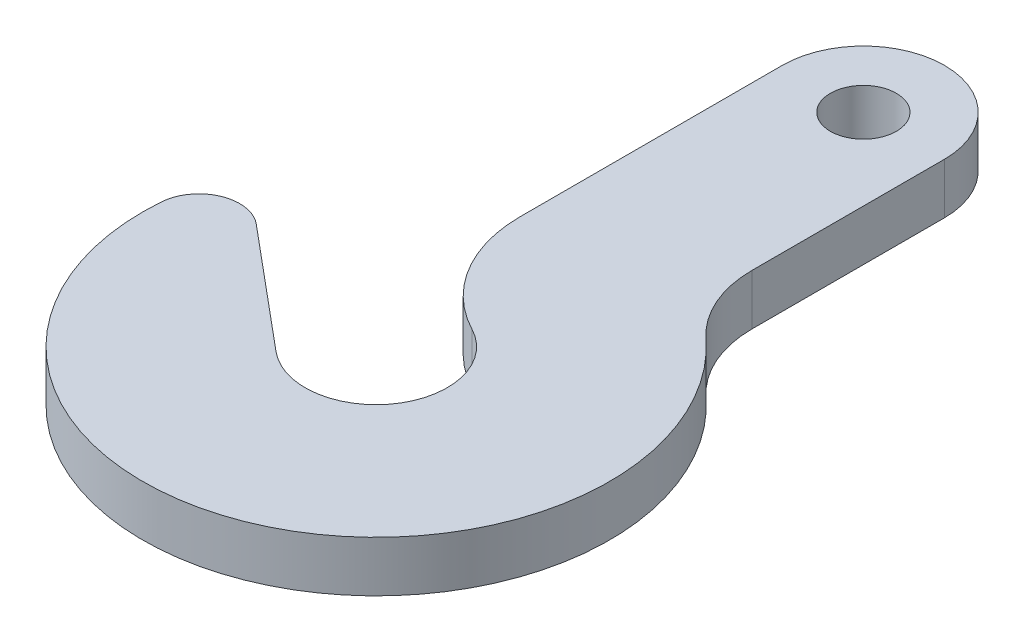
ISO-10303-21;
HEADER;
FILE_DESCRIPTION(('STEP AP214'),'2;1');
FILE_NAME('part.step','',(''),(''),'','','');
FILE_SCHEMA(('AUTOMOTIVE_DESIGN { 1 0 10303 214 1 1 1 1 }'));
ENDSEC;
DATA;
#1=APPLICATION_CONTEXT('core data for automotive mechanical design processes');
#2=APPLICATION_PROTOCOL_DEFINITION('international standard','automotive_design',2000,#1);
#3=PRODUCT_CONTEXT('',#1,'mechanical');
#4=PRODUCT('Part','Part','',(#3));
#5=PRODUCT_RELATED_PRODUCT_CATEGORY('part','',(#4));
#6=PRODUCT_DEFINITION_FORMATION('','',#4);
#7=PRODUCT_DEFINITION_CONTEXT('part definition',#1,'design');
#8=PRODUCT_DEFINITION('design','',#6,#7);
#9=PRODUCT_DEFINITION_SHAPE('','',#8);
#10=(LENGTH_UNIT() NAMED_UNIT(*) SI_UNIT(.MILLI.,.METRE.));
#11=(NAMED_UNIT(*) PLANE_ANGLE_UNIT() SI_UNIT($,.RADIAN.));
#12=(NAMED_UNIT(*) SI_UNIT($,.STERADIAN.) SOLID_ANGLE_UNIT());
#13=UNCERTAINTY_MEASURE_WITH_UNIT(LENGTH_MEASURE(1.E-05),#10,'distance_accuracy_value','');
#14=(GEOMETRIC_REPRESENTATION_CONTEXT(3) GLOBAL_UNCERTAINTY_ASSIGNED_CONTEXT((#13)) GLOBAL_UNIT_ASSIGNED_CONTEXT((#10,
#11,#12)) REPRESENTATION_CONTEXT('',''));
#15=CARTESIAN_POINT('',(0.,0.,0.));
#16=DIRECTION('',(0.,0.,1.));
#17=DIRECTION('',(1.,0.,0.));
#18=AXIS2_PLACEMENT_3D('',#15,#16,#17);
#19=CARTESIAN_POINT('',(-12.2670636126044,10.,14.6790814947279));
#20=DIRECTION('',(0.641247984854573,0.,-0.767333709620494));
#21=DIRECTION('',(-0.767333709620494,0.,-0.641247984854573));
#22=AXIS2_PLACEMENT_3D('',#19,#20,#21);
#23=PLANE('',#22);
#24=DIRECTION('',(0.767333709620494,0.,0.641247984854573));
#25=VECTOR('',#24,1.);
#26=CARTESIAN_POINT('',(-12.2670636126044,0.,14.6790814947279));
#27=LINE('',#26,#25);
#28=CARTESIAN_POINT('',(-40.7524372147139,0.,-9.12567019435971));
#29=VERTEX_POINT('',#28);
#30=CARTESIAN_POINT('',(-16.977471787964,0.,10.7426719346869));
#31=VERTEX_POINT('',#30);
#32=EDGE_CURVE('E160',#29,#31,#27,.T.);
#33=ORIENTED_EDGE('',*,*,#32,.F.);
#34=DIRECTION('',(0.,-1.,0.));
#35=VECTOR('',#34,1.);
#36=CARTESIAN_POINT('',(-40.7524372147139,10.,-9.12567019435971));
#37=LINE('',#36,#35);
#38=CARTESIAN_POINT('',(-40.7524372147139,10.,-9.12567019435971));
#39=VERTEX_POINT('',#38);
#40=EDGE_CURVE('E11',#39,#29,#37,.T.);
#41=ORIENTED_EDGE('',*,*,#40,.F.);
#42=DIRECTION('',(0.767333709620494,0.,0.641247984854573));
#43=VECTOR('',#42,1.);
#44=CARTESIAN_POINT('',(-12.2670636126044,10.,14.6790814947279));
#45=LINE('',#44,#43);
#46=CARTESIAN_POINT('',(-16.977471787964,10.,10.7426719346869));
#47=VERTEX_POINT('',#46);
#48=EDGE_CURVE('E226',#39,#47,#45,.T.);
#49=ORIENTED_EDGE('',*,*,#48,.T.);
#50=DIRECTION('',(0.,-1.,0.));
#51=VECTOR('',#50,1.);
#52=CARTESIAN_POINT('',(-16.977471787964,10.,10.7426719346869));
#53=LINE('',#52,#51);
#54=EDGE_CURVE('E54',#47,#31,#53,.T.);
#55=ORIENTED_EDGE('',*,*,#54,.T.);
#56=EDGE_LOOP('',(#33,#41,#49,#55));
#57=FACE_BOUND('',#56,.T.);
#58=ADVANCED_FACE('F37',(#57),#23,.T.);
#59=CARTESIAN_POINT('',(-45.8824210935505,10.,-2.98700051739576));
#60=DIRECTION('',(0.,-1.,0.));
#61=DIRECTION('',(0.,0.,-1.));
#62=AXIS2_PLACEMENT_3D('',#59,#60,#61);
#63=CYLINDRICAL_SURFACE('',#62,8.);
#64=CARTESIAN_POINT('',(-45.8824210935505,0.,-2.98700051739576));
#65=DIRECTION('',(0.,1.,0.));
#66=DIRECTION('',(0.,0.,1.));
#67=AXIS2_PLACEMENT_3D('',#64,#65,#66);
#68=CIRCLE('',#67,8.);
#69=CARTESIAN_POINT('',(-53.8576676395611,0.,-3.61584273158434));
#70=VERTEX_POINT('',#69);
#71=EDGE_CURVE('E157',#29,#70,#68,.T.);
#72=ORIENTED_EDGE('',*,*,#71,.T.);
#73=DIRECTION('',(0.,-1.,0.));
#74=VECTOR('',#73,1.);
#75=CARTESIAN_POINT('',(-53.8576676395611,10.,-3.61584273158434));
#76=LINE('',#75,#74);
#77=CARTESIAN_POINT('',(-53.8576676395611,10.,-3.61584273158434));
#78=VERTEX_POINT('',#77);
#79=EDGE_CURVE('E46',#78,#70,#76,.T.);
#80=ORIENTED_EDGE('',*,*,#79,.F.);
#81=CARTESIAN_POINT('',(-45.8824210935505,10.,-2.98700051739576));
#82=DIRECTION('',(0.,1.,0.));
#83=DIRECTION('',(0.,0.,1.));
#84=AXIS2_PLACEMENT_3D('',#81,#82,#83);
#85=CIRCLE('',#84,8.);
#86=EDGE_CURVE('E228',#39,#78,#85,.T.);
#87=ORIENTED_EDGE('',*,*,#86,.F.);
#88=ORIENTED_EDGE('',*,*,#40,.T.);
#89=EDGE_LOOP('',(#72,#80,#87,#88));
#90=FACE_BOUND('',#89,.T.);
#91=ADVANCED_FACE('F158',(#90),#63,.T.);
#92=CARTESIAN_POINT('',(-8.,10.,0.));
#93=DIRECTION('',(0.,-1.,0.));
#94=DIRECTION('',(0.,0.,-1.));
#95=AXIS2_PLACEMENT_3D('',#92,#93,#94);
#96=CYLINDRICAL_SURFACE('',#95,46.);
#97=CARTESIAN_POINT('',(-8.,0.,0.));
#98=DIRECTION('',(0.,1.,0.));
#99=DIRECTION('',(0.,0.,1.));
#100=AXIS2_PLACEMENT_3D('',#97,#98,#99);
#101=CIRCLE('',#100,46.);
#102=CARTESIAN_POINT('',(23.1176470588235,0.,-33.8776038338382));
#103=VERTEX_POINT('',#102);
#104=EDGE_CURVE('E151',#70,#103,#101,.T.);
#105=ORIENTED_EDGE('',*,*,#104,.T.);
#106=DIRECTION('',(0.,-1.,0.));
#107=VECTOR('',#106,1.);
#108=CARTESIAN_POINT('',(23.1176470588235,10.,-33.8776038338382));
#109=LINE('',#108,#107);
#110=CARTESIAN_POINT('',(23.1176470588235,10.,-33.8776038338382));
#111=VERTEX_POINT('',#110);
#112=EDGE_CURVE('E143',#111,#103,#109,.T.);
#113=ORIENTED_EDGE('',*,*,#112,.F.);
#114=CARTESIAN_POINT('',(-8.,10.,0.));
#115=DIRECTION('',(0.,1.,0.));
#116=DIRECTION('',(0.,0.,1.));
#117=AXIS2_PLACEMENT_3D('',#114,#115,#116);
#118=CIRCLE('',#117,46.);
#119=EDGE_CURVE('E153',#78,#111,#118,.T.);
#120=ORIENTED_EDGE('',*,*,#119,.F.);
#121=ORIENTED_EDGE('',*,*,#79,.T.);
#122=EDGE_LOOP('',(#105,#113,#120,#121));
#123=FACE_BOUND('',#122,.T.);
#124=ADVANCED_FACE('F149',(#123),#96,.T.);
#125=CARTESIAN_POINT('',(38.,10.,-50.0799361021957));
#126=DIRECTION('',(0.,-1.,0.));
#127=DIRECTION('',(0.,0.,-1.));
#128=AXIS2_PLACEMENT_3D('',#125,#126,#127);
#129=CYLINDRICAL_SURFACE('',#128,22.0000000000002);
#130=CARTESIAN_POINT('',(38.,0.,-50.0799361021957));
#131=DIRECTION('',(0.,1.,0.));
#132=DIRECTION('',(0.,0.,1.));
#133=AXIS2_PLACEMENT_3D('',#130,#131,#132);
#134=CIRCLE('',#133,22.0000000000002);
#135=CARTESIAN_POINT('',(15.9999999999997,0.,-50.0799361021957));
#136=VERTEX_POINT('',#135);
#137=EDGE_CURVE('E162',#136,#103,#134,.T.);
#138=ORIENTED_EDGE('',*,*,#137,.F.);
#139=DIRECTION('',(0.,-1.,0.));
#140=VECTOR('',#139,1.);
#141=CARTESIAN_POINT('',(15.9999999999997,10.,-50.0799361021957));
#142=LINE('',#141,#140);
#143=CARTESIAN_POINT('',(15.9999999999997,10.,-50.0799361021957));
#144=VERTEX_POINT('',#143);
#145=EDGE_CURVE('E141',#144,#136,#142,.T.);
#146=ORIENTED_EDGE('',*,*,#145,.F.);
#147=CARTESIAN_POINT('',(38.,10.,-50.0799361021957));
#148=DIRECTION('',(0.,1.,0.));
#149=DIRECTION('',(0.,0.,1.));
#150=AXIS2_PLACEMENT_3D('',#147,#148,#149);
#151=CIRCLE('',#150,22.0000000000002);
#152=EDGE_CURVE('E233',#144,#111,#151,.T.);
#153=ORIENTED_EDGE('',*,*,#152,.T.);
#154=ORIENTED_EDGE('',*,*,#112,.T.);
#155=EDGE_LOOP('',(#138,#146,#153,#154));
#156=FACE_BOUND('',#155,.T.);
#157=ADVANCED_FACE('F205',(#156),#129,.F.);
#158=CARTESIAN_POINT('',(15.9999999999997,10.,0.));
#159=DIRECTION('',(1.,0.,0.));
#160=DIRECTION('',(0.,0.,-1.));
#161=AXIS2_PLACEMENT_3D('',#158,#159,#160);
#162=PLANE('',#161);
#163=DIRECTION('',(0.,0.,1.));
#164=VECTOR('',#163,1.);
#165=CARTESIAN_POINT('',(15.9999999999997,0.,0.));
#166=LINE('',#165,#164);
#167=CARTESIAN_POINT('',(15.9999999999997,0.,-88.));
#168=VERTEX_POINT('',#167);
#169=EDGE_CURVE('E169',#168,#136,#166,.T.);
#170=ORIENTED_EDGE('',*,*,#169,.F.);
#171=DIRECTION('',(0.,-1.,0.));
#172=VECTOR('',#171,1.);
#173=CARTESIAN_POINT('',(15.9999999999997,10.,-88.));
#174=LINE('',#173,#172);
#175=CARTESIAN_POINT('',(15.9999999999997,10.,-88.));
#176=VERTEX_POINT('',#175);
#177=EDGE_CURVE('E135',#176,#168,#174,.T.);
#178=ORIENTED_EDGE('',*,*,#177,.F.);
#179=DIRECTION('',(0.,0.,1.));
#180=VECTOR('',#179,1.);
#181=CARTESIAN_POINT('',(15.9999999999997,10.,0.));
#182=LINE('',#181,#180);
#183=EDGE_CURVE('E236',#176,#144,#182,.T.);
#184=ORIENTED_EDGE('',*,*,#183,.T.);
#185=ORIENTED_EDGE('',*,*,#145,.T.);
#186=EDGE_LOOP('',(#170,#178,#184,#185));
#187=FACE_BOUND('',#186,.T.);
#188=ADVANCED_FACE('F208',(#187),#162,.T.);
#189=CARTESIAN_POINT('',(-3.07250357818211E-13,10.,-88.));
#190=DIRECTION('',(0.,-1.,0.));
#191=DIRECTION('',(0.,0.,-1.));
#192=AXIS2_PLACEMENT_3D('',#189,#190,#191);
#193=CYLINDRICAL_SURFACE('',#192,16.);
#194=CARTESIAN_POINT('',(-3.07250357818211E-13,0.,-88.));
#195=DIRECTION('',(0.,1.,0.));
#196=DIRECTION('',(0.,0.,1.));
#197=AXIS2_PLACEMENT_3D('',#194,#195,#196);
#198=CIRCLE('',#197,16.);
#199=CARTESIAN_POINT('',(-16.0000000000003,0.,-88.));
#200=VERTEX_POINT('',#199);
#201=EDGE_CURVE('E172',#168,#200,#198,.T.);
#202=ORIENTED_EDGE('',*,*,#201,.T.);
#203=DIRECTION('',(0.,-1.,0.));
#204=VECTOR('',#203,1.);
#205=CARTESIAN_POINT('',(-16.0000000000003,10.,-88.));
#206=LINE('',#205,#204);
#207=CARTESIAN_POINT('',(-16.0000000000003,10.,-88.));
#208=VERTEX_POINT('',#207);
#209=EDGE_CURVE('E133',#208,#200,#206,.T.);
#210=ORIENTED_EDGE('',*,*,#209,.F.);
#211=CARTESIAN_POINT('',(-3.07250357818211E-13,10.,-88.));
#212=DIRECTION('',(0.,1.,0.));
#213=DIRECTION('',(0.,0.,1.));
#214=AXIS2_PLACEMENT_3D('',#211,#212,#213);
#215=CIRCLE('',#214,16.);
#216=EDGE_CURVE('E126',#176,#208,#215,.T.);
#217=ORIENTED_EDGE('',*,*,#216,.F.);
#218=ORIENTED_EDGE('',*,*,#177,.T.);
#219=EDGE_LOOP('',(#202,#210,#217,#218));
#220=FACE_BOUND('',#219,.T.);
#221=ADVANCED_FACE('F212',(#220),#193,.T.);
#222=CARTESIAN_POINT('',(-16.0000000000003,10.,0.));
#223=DIRECTION('',(1.,0.,0.));
#224=DIRECTION('',(0.,0.,-1.));
#225=AXIS2_PLACEMENT_3D('',#222,#223,#224);
#226=PLANE('',#225);
#227=DIRECTION('',(0.,0.,1.));
#228=VECTOR('',#227,1.);
#229=CARTESIAN_POINT('',(-16.0000000000003,0.,0.));
#230=LINE('',#229,#228);
#231=CARTESIAN_POINT('',(-16.0000000000003,0.,-36.3318042491699));
#232=VERTEX_POINT('',#231);
#233=EDGE_CURVE('E132',#200,#232,#230,.T.);
#234=ORIENTED_EDGE('',*,*,#233,.T.);
#235=DIRECTION('',(0.,-1.,0.));
#236=VECTOR('',#235,1.);
#237=CARTESIAN_POINT('',(-16.0000000000003,10.,-36.3318042491699));
#238=LINE('',#237,#236);
#239=CARTESIAN_POINT('',(-16.0000000000003,10.,-36.3318042491699));
#240=VERTEX_POINT('',#239);
#241=EDGE_CURVE('E114',#240,#232,#238,.T.);
#242=ORIENTED_EDGE('',*,*,#241,.F.);
#243=DIRECTION('',(0.,0.,1.));
#244=VECTOR('',#243,1.);
#245=CARTESIAN_POINT('',(-16.0000000000003,10.,0.));
#246=LINE('',#245,#244);
#247=EDGE_CURVE('E119',#208,#240,#246,.T.);
#248=ORIENTED_EDGE('',*,*,#247,.F.);
#249=ORIENTED_EDGE('',*,*,#209,.T.);
#250=EDGE_LOOP('',(#234,#242,#248,#249));
#251=FACE_BOUND('',#250,.T.);
#252=ADVANCED_FACE('F131',(#251),#226,.F.);
#253=CARTESIAN_POINT('',(11.,10.,-36.3318042491699));
#254=DIRECTION('',(0.,-1.,0.));
#255=DIRECTION('',(0.,0.,-1.));
#256=AXIS2_PLACEMENT_3D('',#253,#254,#255);
#257=CYLINDRICAL_SURFACE('',#256,27.0000000000002);
#258=CARTESIAN_POINT('',(11.,0.,-36.3318042491699));
#259=DIRECTION('',(0.,1.,0.));
#260=DIRECTION('',(0.,0.,1.));
#261=AXIS2_PLACEMENT_3D('',#258,#259,#260);
#262=CIRCLE('',#261,27.0000000000002);
#263=CARTESIAN_POINT('',(-1.51219512195126,0.,-12.4059819387409));
#264=VERTEX_POINT('',#263);
#265=EDGE_CURVE('E176',#232,#264,#262,.T.);
#266=ORIENTED_EDGE('',*,*,#265,.T.);
#267=DIRECTION('',(0.,-1.,0.));
#268=VECTOR('',#267,1.);
#269=CARTESIAN_POINT('',(-1.51219512195126,10.,-12.4059819387409));
#270=LINE('',#269,#268);
#271=CARTESIAN_POINT('',(-1.51219512195126,10.,-12.4059819387409));
#272=VERTEX_POINT('',#271);
#273=EDGE_CURVE('E83',#272,#264,#270,.T.);
#274=ORIENTED_EDGE('',*,*,#273,.F.);
#275=CARTESIAN_POINT('',(11.,10.,-36.3318042491699));
#276=DIRECTION('',(0.,1.,0.));
#277=DIRECTION('',(0.,0.,1.));
#278=AXIS2_PLACEMENT_3D('',#275,#276,#277);
#279=CIRCLE('',#278,27.0000000000002);
#280=EDGE_CURVE('E110',#240,#272,#279,.T.);
#281=ORIENTED_EDGE('',*,*,#280,.F.);
#282=ORIENTED_EDGE('',*,*,#241,.T.);
#283=EDGE_LOOP('',(#266,#274,#281,#282));
#284=FACE_BOUND('',#283,.T.);
#285=ADVANCED_FACE('F112',(#284),#257,.T.);
#286=CARTESIAN_POINT('',(-3.07250357818211E-13,10.,-88.));
#287=DIRECTION('',(0.,-1.,0.));
#288=DIRECTION('',(0.,0.,-1.));
#289=AXIS2_PLACEMENT_3D('',#286,#287,#288);
#290=CYLINDRICAL_SURFACE('',#289,6.5);
#291=CARTESIAN_POINT('',(-3.07250357818211E-13,10.,-88.));
#292=DIRECTION('',(0.,1.,0.));
#293=DIRECTION('',(0.,0.,1.));
#294=AXIS2_PLACEMENT_3D('',#291,#292,#293);
#295=CIRCLE('',#294,6.5);
#296=CARTESIAN_POINT('',(-3.07250357818211E-13,10.,-81.5));
#297=VERTEX_POINT('',#296);
#298=EDGE_CURVE('E180',#297,#297,#295,.T.);
#299=ORIENTED_EDGE('',*,*,#298,.T.);
#300=EDGE_LOOP('',(#299));
#301=FACE_BOUND('',#300,.T.);
#302=CARTESIAN_POINT('',(-3.07250357818211E-13,0.,-88.));
#303=DIRECTION('',(0.,1.,0.));
#304=DIRECTION('',(0.,0.,1.));
#305=AXIS2_PLACEMENT_3D('',#302,#303,#304);
#306=CIRCLE('',#305,6.5);
#307=CARTESIAN_POINT('',(-3.07250357818211E-13,0.,-81.5));
#308=VERTEX_POINT('',#307);
#309=EDGE_CURVE('E164',#308,#308,#306,.T.);
#310=ORIENTED_EDGE('',*,*,#309,.F.);
#311=EDGE_LOOP('',(#310));
#312=FACE_BOUND('',#311,.T.);
#313=ADVANCED_FACE('F39',(#301,#312),#290,.F.);
#314=CARTESIAN_POINT('',(-8.,10.,0.));
#315=DIRECTION('',(0.,-1.,0.));
#316=DIRECTION('',(0.,0.,-1.));
#317=AXIS2_PLACEMENT_3D('',#314,#315,#316);
#318=CYLINDRICAL_SURFACE('',#317,13.9999999999999);
#319=CARTESIAN_POINT('',(-8.,0.,0.));
#320=DIRECTION('',(0.,1.,0.));
#321=DIRECTION('',(0.,0.,1.));
#322=AXIS2_PLACEMENT_3D('',#319,#320,#321);
#323=CIRCLE('',#322,13.9999999999999);
#324=EDGE_CURVE('E178',#31,#264,#323,.T.);
#325=ORIENTED_EDGE('',*,*,#324,.F.);
#326=ORIENTED_EDGE('',*,*,#54,.F.);
#327=CARTESIAN_POINT('',(-8.,10.,0.));
#328=DIRECTION('',(0.,1.,0.));
#329=DIRECTION('',(0.,0.,1.));
#330=AXIS2_PLACEMENT_3D('',#327,#328,#329);
#331=CIRCLE('',#330,13.9999999999999);
#332=EDGE_CURVE('E118',#47,#272,#331,.T.);
#333=ORIENTED_EDGE('',*,*,#332,.T.);
#334=ORIENTED_EDGE('',*,*,#273,.T.);
#335=EDGE_LOOP('',(#325,#326,#333,#334));
#336=FACE_BOUND('',#335,.T.);
#337=ADVANCED_FACE('F188',(#336),#318,.F.);
#338=CARTESIAN_POINT('',(0.,10.,0.));
#339=DIRECTION('',(0.,1.,0.));
#340=DIRECTION('',(0.,0.,1.));
#341=AXIS2_PLACEMENT_3D('',#338,#339,#340);
#342=PLANE('',#341);
#343=ORIENTED_EDGE('',*,*,#298,.F.);
#344=EDGE_LOOP('',(#343));
#345=FACE_BOUND('',#344,.T.);
#346=ORIENTED_EDGE('',*,*,#48,.F.);
#347=ORIENTED_EDGE('',*,*,#86,.T.);
#348=ORIENTED_EDGE('',*,*,#119,.T.);
#349=ORIENTED_EDGE('',*,*,#152,.F.);
#350=ORIENTED_EDGE('',*,*,#183,.F.);
#351=ORIENTED_EDGE('',*,*,#216,.T.);
#352=ORIENTED_EDGE('',*,*,#247,.T.);
#353=ORIENTED_EDGE('',*,*,#280,.T.);
#354=ORIENTED_EDGE('',*,*,#332,.F.);
#355=EDGE_LOOP('',(#346,#347,#348,#349,#350,#351,#352,#353,#354));
#356=FACE_BOUND('',#355,.T.);
#357=ADVANCED_FACE('F123',(#345,#356),#342,.T.);
#358=CARTESIAN_POINT('',(0.,0.,0.));
#359=DIRECTION('',(0.,1.,0.));
#360=DIRECTION('',(0.,0.,1.));
#361=AXIS2_PLACEMENT_3D('',#358,#359,#360);
#362=PLANE('',#361);
#363=ORIENTED_EDGE('',*,*,#309,.T.);
#364=EDGE_LOOP('',(#363));
#365=FACE_BOUND('',#364,.T.);
#366=ORIENTED_EDGE('',*,*,#32,.T.);
#367=ORIENTED_EDGE('',*,*,#324,.T.);
#368=ORIENTED_EDGE('',*,*,#265,.F.);
#369=ORIENTED_EDGE('',*,*,#233,.F.);
#370=ORIENTED_EDGE('',*,*,#201,.F.);
#371=ORIENTED_EDGE('',*,*,#169,.T.);
#372=ORIENTED_EDGE('',*,*,#137,.T.);
#373=ORIENTED_EDGE('',*,*,#104,.F.);
#374=ORIENTED_EDGE('',*,*,#71,.F.);
#375=EDGE_LOOP('',(#366,#367,#368,#369,#370,#371,#372,#373,#374));
#376=FACE_BOUND('',#375,.T.);
#377=ADVANCED_FACE('F185',(#365,#376),#362,.F.);
#378=CLOSED_SHELL('',(#58,#91,#124,#157,#188,#221,#252,#285,#313,#337,#357,#377));
#379=MANIFOLD_SOLID_BREP('B2',#378);
#380=ADVANCED_BREP_SHAPE_REPRESENTATION('',(#18,#379),#14);
#381=SHAPE_DEFINITION_REPRESENTATION(#9,#380);
ENDSEC;
END-ISO-10303-21;
